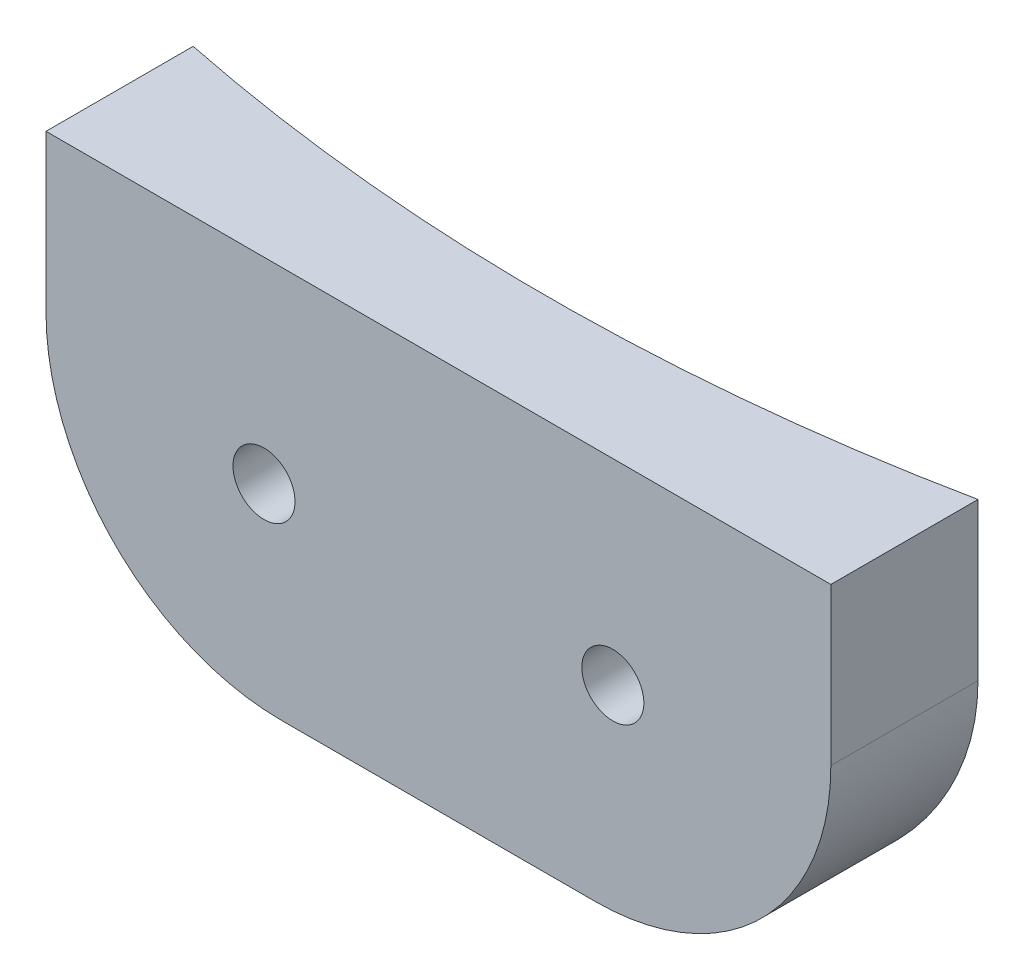
ISO-10303-21;
HEADER;
FILE_DESCRIPTION(('STEP AP214'),'2;1');
FILE_NAME('part.step','',(''),(''),'','','');
FILE_SCHEMA(('AUTOMOTIVE_DESIGN { 1 0 10303 214 1 1 1 1 }'));
ENDSEC;
DATA;
#1=APPLICATION_CONTEXT('core data for automotive mechanical design processes');
#2=APPLICATION_PROTOCOL_DEFINITION('international standard','automotive_design',2000,#1);
#3=PRODUCT_CONTEXT('',#1,'mechanical');
#4=PRODUCT('Part','Part','',(#3));
#5=PRODUCT_RELATED_PRODUCT_CATEGORY('part','',(#4));
#6=PRODUCT_DEFINITION_FORMATION('','',#4);
#7=PRODUCT_DEFINITION_CONTEXT('part definition',#1,'design');
#8=PRODUCT_DEFINITION('design','',#6,#7);
#9=PRODUCT_DEFINITION_SHAPE('','',#8);
#10=(LENGTH_UNIT() NAMED_UNIT(*) SI_UNIT(.MILLI.,.METRE.));
#11=(NAMED_UNIT(*) PLANE_ANGLE_UNIT() SI_UNIT($,.RADIAN.));
#12=(NAMED_UNIT(*) SI_UNIT($,.STERADIAN.) SOLID_ANGLE_UNIT());
#13=UNCERTAINTY_MEASURE_WITH_UNIT(LENGTH_MEASURE(1.E-05),#10,'distance_accuracy_value','');
#14=(GEOMETRIC_REPRESENTATION_CONTEXT(3) GLOBAL_UNCERTAINTY_ASSIGNED_CONTEXT((#13)) GLOBAL_UNIT_ASSIGNED_CONTEXT((#10,
#11,#12)) REPRESENTATION_CONTEXT('',''));
#15=CARTESIAN_POINT('',(0.,0.,0.));
#16=DIRECTION('',(0.,0.,1.));
#17=DIRECTION('',(1.,0.,0.));
#18=AXIS2_PLACEMENT_3D('',#15,#16,#17);
#19=CARTESIAN_POINT('',(0.,12.7,0.));
#20=DIRECTION('',(0.,-1.,0.));
#21=DIRECTION('',(0.,0.,-1.));
#22=AXIS2_PLACEMENT_3D('',#19,#20,#21);
#23=CYLINDRICAL_SURFACE('',#22,63.5);
#24=CARTESIAN_POINT('',(4.64114444444444,6.35,63.3301648367174));
#25=CARTESIAN_POINT('',(4.64114695278914,6.40623714740319,63.3301647205125));
#26=CARTESIAN_POINT('',(4.64588883149999,6.46251503125265,63.3298176984855));
#27=CARTESIAN_POINT('',(4.66473701975215,6.57351908417886,63.3284321168356));
#28=CARTESIAN_POINT('',(4.67885457723963,6.62824330700915,63.327392726578));
#29=CARTESIAN_POINT('',(4.7160448376379,6.73451414085425,63.3246339646137));
#30=CARTESIAN_POINT('',(4.73911284972963,6.78606239997985,63.322914949081));
#31=CARTESIAN_POINT('',(4.79353425647397,6.88453450948576,63.3188184532647));
#32=CARTESIAN_POINT('',(4.82488562025339,6.93145948951354,63.3164411343741));
#33=CARTESIAN_POINT('',(4.89501669169033,7.01943006795148,63.311057850007));
#34=CARTESIAN_POINT('',(4.93380472727038,7.06046898395219,63.3080511794043));
#35=CARTESIAN_POINT('',(5.01767798433643,7.13545490348017,63.3014586997648));
#36=CARTESIAN_POINT('',(5.0627635207434,7.16940155213033,63.297872861764));
#37=CARTESIAN_POINT('',(5.15806985848827,7.22933356815663,63.2901777790091));
#38=CARTESIAN_POINT('',(5.20830355887698,7.25529825214407,63.2860672128655));
#39=CARTESIAN_POINT('',(5.31238096803179,7.29842924083869,63.277415660694));
#40=CARTESIAN_POINT('',(5.36622473413357,7.31559540576886,63.2728746678296));
#41=CARTESIAN_POINT('',(5.4761786498746,7.34070065743048,63.2634532735112));
#42=CARTESIAN_POINT('',(5.53229558386467,7.34860963657356,63.2585718189924));
#43=CARTESIAN_POINT('',(5.6450431349119,7.35488733611016,63.2486101872706));
#44=CARTESIAN_POINT('',(5.70167376020645,7.35325590324544,63.2435300068765));
#45=CARTESIAN_POINT('',(5.81400219776037,7.34048711123001,63.233302682978));
#46=CARTESIAN_POINT('',(5.8696971074063,7.32932431917814,63.2281553966311));
#47=CARTESIAN_POINT('',(5.97842059113657,7.29777368000457,63.2179679405509));
#48=CARTESIAN_POINT('',(6.03144914015671,7.2773857461832,63.2129277718247));
#49=CARTESIAN_POINT('',(6.13336170092242,7.22794089864989,63.2031209609398));
#50=CARTESIAN_POINT('',(6.18224346888084,7.1988793296501,63.1983544673094));
#51=CARTESIAN_POINT('',(6.27443249344282,7.13290402334776,63.1892684392521));
#52=CARTESIAN_POINT('',(6.31773980652327,7.09599036560769,63.184948900297));
#53=CARTESIAN_POINT('',(6.39742944665497,7.01545141606892,63.1769301251959));
#54=CARTESIAN_POINT('',(6.43382903670366,6.97184336154829,63.1732293455488));
#55=CARTESIAN_POINT('',(6.49878178246781,6.87907878000634,63.166580601289));
#56=CARTESIAN_POINT('',(6.52733514375433,6.8299223983987,63.1636326169532));
#57=CARTESIAN_POINT('',(6.57564139496877,6.72770784336846,63.158621977438));
#58=CARTESIAN_POINT('',(6.59543577736685,6.67466948396411,63.1565551498398));
#59=CARTESIAN_POINT('',(6.6258414474378,6.56599573521499,63.1533725223341));
#60=CARTESIAN_POINT('',(6.6364529968323,6.51036041993417,63.1522566953218));
#61=CARTESIAN_POINT('',(6.64815339580896,6.3983385683328,63.1510260529398));
#62=CARTESIAN_POINT('',(6.64928458670598,6.34195649987584,63.1509067867228));
#63=CARTESIAN_POINT('',(6.64210232141257,6.22980449286256,63.1516626014891));
#64=CARTESIAN_POINT('',(6.6337889861862,6.17403454647552,63.1525376697369));
#65=CARTESIAN_POINT('',(6.60798025739342,6.06476930631786,63.1552433546533));
#66=CARTESIAN_POINT('',(6.59049775951404,6.01127093170214,63.157072629288));
#67=CARTESIAN_POINT('',(6.54686738020195,5.90797359433023,63.1616102216266));
#68=CARTESIAN_POINT('',(6.52071941322536,5.85817466810024,63.1643185480083));
#69=CARTESIAN_POINT('',(6.4604348778131,5.76354828536575,63.1705128852129));
#70=CARTESIAN_POINT('',(6.42627813296482,5.71873381363342,63.1740008591383));
#71=CARTESIAN_POINT('',(6.35099067628744,5.63546948081602,63.1816139815897));
#72=CARTESIAN_POINT('',(6.30985978385501,5.59701978460491,63.1857391466162));
#73=CARTESIAN_POINT('',(6.22157376355687,5.52737671026456,63.1944933791092));
#74=CARTESIAN_POINT('',(6.17439026333612,5.49621959564505,63.1991248035545));
#75=CARTESIAN_POINT('',(6.07549321902851,5.44226601289503,63.2087086351582));
#76=CARTESIAN_POINT('',(6.02377956431028,5.41946974901625,63.2136610501546));
#77=CARTESIAN_POINT('',(5.91704605332402,5.38278893040547,63.2237411835219));
#78=CARTESIAN_POINT('',(5.86201287432134,5.36894331576108,63.2288695670132));
#79=CARTESIAN_POINT('',(5.75040025442613,5.35070933434631,63.2391179291409));
#80=CARTESIAN_POINT('',(5.69382079149116,5.34632110246323,63.2442379076564));
#81=CARTESIAN_POINT('',(5.58062245784471,5.34713089366685,63.2543270226457));
#82=CARTESIAN_POINT('',(5.52400367521204,5.35234468486953,63.2592958973592));
#83=CARTESIAN_POINT('',(5.41243143947483,5.37225158499043,63.2689396351984));
#84=CARTESIAN_POINT('',(5.35747798288412,5.38694467406333,63.2736144989395));
#85=CARTESIAN_POINT('',(5.2508759486794,5.42538063545904,63.2825502140484));
#86=CARTESIAN_POINT('',(5.19922325231413,5.44911196160464,63.2868115849663));
#87=CARTESIAN_POINT('',(5.1006311069955,5.50496299437788,63.2948340046628));
#88=CARTESIAN_POINT('',(5.05369140486846,5.53708225008672,63.29859508032));
#89=CARTESIAN_POINT('',(4.96601453240116,5.60869182525746,63.3055339713231));
#90=CARTESIAN_POINT('',(4.92525855618289,5.64815894846271,63.3087135613904));
#91=CARTESIAN_POINT('',(4.85094158169337,5.73342673789043,63.3144514237991));
#92=CARTESIAN_POINT('',(4.81738225451812,5.7792288710795,63.3170095518524));
#93=CARTESIAN_POINT('',(4.75852419133233,5.87571863046791,63.3214601788366));
#94=CARTESIAN_POINT('',(4.73320359584166,5.92639285862004,63.3233544402249));
#95=CARTESIAN_POINT('',(4.69145564065224,6.03125185143414,63.3264611865357));
#96=CARTESIAN_POINT('',(4.67501747590747,6.0854322607045,63.3276744998683));
#97=CARTESIAN_POINT('',(4.65590265290836,6.17496796638905,63.3290819494507));
#98=CARTESIAN_POINT('',(4.65037534556688,6.20973722664739,63.3294877846053));
#99=CARTESIAN_POINT('',(4.6429954592254,6.27966567925237,63.3300292644079));
#100=CARTESIAN_POINT('',(4.64114287552866,6.31482487110058,63.3301649094011));
#101=CARTESIAN_POINT('',(4.64114444444444,6.35,63.3301648367174));
#102=B_SPLINE_CURVE_WITH_KNOTS('',3,(#24,#25,#26,#27,#28,#29,#30,#31,#32,#33,#34,#35,#36,#37,
#38,#39,#40,#41,#42,#43,#44,#45,#46,#47,#48,#49,#50,#51,#52,#53,#54,#55,#56,#57,#58,#59,#60,#61,
#62,#63,#64,#65,#66,#67,#68,#69,#70,#71,#72,#73,#74,#75,#76,#77,#78,#79,#80,#81,#82,#83,#84,#85,
#86,#87,#88,#89,#90,#91,#92,#93,#94,#95,#96,#97,#98,#99,#100,#101),.UNSPECIFIED.,.T.,.F.,(4,2,2,
2,2,2,2,2,2,2,2,2,2,2,2,2,2,2,2,2,2,2,2,2,2,2,2,2,2,2,2,2,2,2,2,2,2,2,4),(0.,0.168582910968482,
0.337368436090966,0.506065622097464,0.674721486040734,0.843567333435946,1.01242162738004,
1.18170984949717,1.3510007609157,1.52084074868163,1.69068346478348,1.8609808002614,
2.03127973626012,2.20167023947487,2.37205901626426,2.5420162015499,2.71196893353567,
2.88110772460663,3.0502416948626,3.2186198717315,3.38699589206239,3.5551357376282,
3.72327724308832,3.8918469850999,4.06042109308027,4.22981645150797,4.39921594791104,
4.56934754902163,4.73948157664298,4.90989524174182,5.08030855007356,5.25050488489732,
5.42069207217933,5.59035084080781,5.76004896245023,5.92929308834748,6.09833087083474,
6.20377599877129,6.30922099193644),.UNSPECIFIED.);
#103=CARTESIAN_POINT('',(4.64114444444444,6.35,63.3301648367174));
#104=VERTEX_POINT('',#103);
#105=EDGE_CURVE('E171',#104,#104,#102,.T.);
#106=ORIENTED_EDGE('',*,*,#105,.F.);
#107=EDGE_LOOP('',(#106));
#108=FACE_BOUND('',#107,.T.);
#109=DIRECTION('',(0.,-1.,0.));
#110=VECTOR('',#109,1.);
#111=CARTESIAN_POINT('',(12.7,12.7,62.2170394666927));
#112=LINE('',#111,#110);
#113=CARTESIAN_POINT('',(12.7,12.7,62.2170394666927));
#114=VERTEX_POINT('',#113);
#115=CARTESIAN_POINT('',(12.7,7.62,62.2170394666927));
#116=VERTEX_POINT('',#115);
#117=EDGE_CURVE('E130',#114,#116,#112,.T.);
#118=ORIENTED_EDGE('',*,*,#117,.T.);
#119=CARTESIAN_POINT('',(12.7,7.62,62.2170394666927));
#120=CARTESIAN_POINT('',(12.700025344572,7.40828698854175,62.2170260491477));
#121=CARTESIAN_POINT('',(12.6911777948314,7.19657987497164,62.2188400407955));
#122=CARTESIAN_POINT('',(12.6559216828134,6.77471626691733,62.2260254545056));
#123=CARTESIAN_POINT('',(12.6295150529205,6.56455960437821,62.231396485114));
#124=CARTESIAN_POINT('',(12.5593777999632,6.14759949257848,62.2455880424606));
#125=CARTESIAN_POINT('',(12.5156730617354,5.94079151148967,62.2544034148448));
#126=CARTESIAN_POINT('',(12.4112928823802,5.53167390932802,62.2752973349806));
#127=CARTESIAN_POINT('',(12.3506174306677,5.32936429106103,62.2873758847677));
#128=CARTESIAN_POINT('',(12.2127661061429,4.93066154319659,62.3145510233819));
#129=CARTESIAN_POINT('',(12.1355904901467,4.73426832156793,62.3296475652356));
#130=CARTESIAN_POINT('',(11.9652932532413,4.34867390222739,62.3625631088523));
#131=CARTESIAN_POINT('',(11.8721657605176,4.15947538430401,62.3803831128484));
#132=CARTESIAN_POINT('',(11.6706887891849,3.78965333015597,62.4183909182039));
#133=CARTESIAN_POINT('',(11.5623415931071,3.60902851353972,62.4385783644382));
#134=CARTESIAN_POINT('',(11.3311918454023,3.25751782799266,62.4809402333614));
#135=CARTESIAN_POINT('',(11.2083887507748,3.08663232525341,62.5031147306815));
#136=CARTESIAN_POINT('',(10.9477113683039,2.75383642683002,62.5493031972765));
#137=CARTESIAN_POINT('',(10.8096810040173,2.59205079104604,62.573335279116));
#138=CARTESIAN_POINT('',(10.5206867724196,2.28066973268071,62.6225728430067));
#139=CARTESIAN_POINT('',(10.3697228175217,2.13107439266601,62.6477783330038));
#140=CARTESIAN_POINT('',(10.0558633178888,1.8450301311244,62.6989225853166));
#141=CARTESIAN_POINT('',(9.89296490237415,1.70858439107044,62.7248615231325));
#142=CARTESIAN_POINT('',(9.55637879028887,1.4497893210675,62.777023044104));
#143=CARTESIAN_POINT('',(9.38269122958812,1.32743981365727,62.8032456236842));
#144=CARTESIAN_POINT('',(9.0229993506751,1.09592267835218,62.8559385268488));
#145=CARTESIAN_POINT('',(8.8368488232233,0.986981585237584,62.8824066255162));
#146=CARTESIAN_POINT('',(8.45599206584206,0.785272469216312,62.9347529910899));
#147=CARTESIAN_POINT('',(8.2612889008333,0.692498710842588,62.9606314643261));
#148=CARTESIAN_POINT('',(7.86466329934288,0.523770888224452,63.0114037881705));
#149=CARTESIAN_POINT('',(7.66274311304734,0.447811633632491,63.0362979406672));
#150=CARTESIAN_POINT('',(7.2531264658293,0.313262144610086,63.0847424716456));
#151=CARTESIAN_POINT('',(7.04543133959186,0.254667932731201,63.1082931568479));
#152=CARTESIAN_POINT('',(6.54837922821547,0.137006691979756,63.1621080063384));
#153=CARTESIAN_POINT('',(6.25705443505743,0.0856748570420428,63.1916598413567));
#154=CARTESIAN_POINT('',(5.81715464870499,0.0343009255753581,63.2331597179957));
#155=CARTESIAN_POINT('',(5.67008456709404,0.0214469378299054,63.2465177875438));
#156=CARTESIAN_POINT('',(5.37537069796819,0.00429760958948188,63.2722472948987));
#157=CARTESIAN_POINT('',(5.22772695110383,1.67335718152917E-06,63.2846188013239));
#158=CARTESIAN_POINT('',(5.08000000000001,0.,63.2964738354357));
#159=B_SPLINE_CURVE_WITH_KNOTS('',3,(#119,#120,#121,#122,#123,#124,#125,#126,#127,#128,#129,
#130,#131,#132,#133,#134,#135,#136,#137,#138,#139,#140,#141,#142,#143,#144,#145,#146,#147,#148,
#149,#150,#151,#152,#153,#154,#155,#156,#157,#158),.UNSPECIFIED.,.F.,.F.,(4,2,2,2,2,2,2,2,2,2,2,
2,2,2,2,2,2,2,2,4),(0.,0.634937674846585,1.26980548608461,1.90372685319809,2.53764861570588,
3.17156051228586,3.80570625242187,4.43975698971342,5.07383155117456,5.71514615624657,
6.35646510467457,6.99793882916962,7.63940447709726,8.29054072661027,8.94144550897539,
9.59214908719896,10.2427035069186,11.1322670135707,11.57675789098,12.0212178257077),.UNSPECIFIED.);
#160=CARTESIAN_POINT('',(5.08000000000001,0.,63.2964738354357));
#161=VERTEX_POINT('',#160);
#162=EDGE_CURVE('E56',#116,#161,#159,.T.);
#163=ORIENTED_EDGE('',*,*,#162,.T.);
#164=CARTESIAN_POINT('',(0.,0.,0.));
#165=DIRECTION('',(0.,1.,0.));
#166=DIRECTION('',(0.,0.,1.));
#167=AXIS2_PLACEMENT_3D('',#164,#165,#166);
#168=CIRCLE('',#167,63.5);
#169=CARTESIAN_POINT('',(-5.07999999999999,0.,63.2964738354357));
#170=VERTEX_POINT('',#169);
#171=EDGE_CURVE('E122',#170,#161,#168,.T.);
#172=ORIENTED_EDGE('',*,*,#171,.F.);
#173=CARTESIAN_POINT('',(-5.07999999999999,0.,63.2964738354357));
#174=CARTESIAN_POINT('',(-5.29532177734775,-2.33084172623505E-05,63.2792038185139));
#175=CARTESIAN_POINT('',(-5.51054539309441,0.00912557571904402,63.2608140470481));
#176=CARTESIAN_POINT('',(-5.93924585119758,0.0455512941111531,63.2220001236722));
#177=CARTESIAN_POINT('',(-6.15272288022638,0.072826164778146,63.2015761923263));
#178=CARTESIAN_POINT('',(-6.57619312281003,0.145247508457728,63.1589188099163));
#179=CARTESIAN_POINT('',(-6.7861899224905,0.190374216891556,63.1366873815674));
#180=CARTESIAN_POINT('',(-7.20146899504584,0.298130021288826,63.0906685996438));
#181=CARTESIAN_POINT('',(-7.40675124757998,0.36075919275055,63.0668812393577));
#182=CARTESIAN_POINT('',(-7.81117433896537,0.503045595686192,63.0180692537221));
#183=CARTESIAN_POINT('',(-8.01031517187719,0.582702843627513,62.9930446271761));
#184=CARTESIAN_POINT('',(-8.40115696184806,0.758495187591141,62.9421116335453));
#185=CARTESIAN_POINT('',(-8.59285515139037,0.854636342461205,62.9162029443279));
#186=CARTESIAN_POINT('',(-8.96738357383356,1.06267373352409,62.8639147846366));
#187=CARTESIAN_POINT('',(-9.15021558910631,1.17456678530376,62.8375354102555));
#188=CARTESIAN_POINT('',(-9.50580714769593,1.41335047485512,62.7847270102528));
#189=CARTESIAN_POINT('',(-9.67856644201161,1.54024148314701,62.7582979834204));
#190=CARTESIAN_POINT('',(-10.0139335069992,1.80904589144173,62.7056627666621));
#191=CARTESIAN_POINT('',(-10.176466176295,1.95105352952414,62.6794592252326));
#192=CARTESIAN_POINT('',(-10.488975825278,2.24841711941726,62.627920872193));
#193=CARTESIAN_POINT('',(-10.6389527471308,2.40377313270675,62.6025860645849));
#194=CARTESIAN_POINT('',(-10.9253059363616,2.7268013701968,62.5532477886997));
#195=CARTESIAN_POINT('',(-11.0616796895713,2.89447586121847,62.5292445668918));
#196=CARTESIAN_POINT('',(-11.3197958883905,3.24095744412969,62.4830330339896));
#197=CARTESIAN_POINT('',(-11.4415388348639,3.41976415460587,62.4608246614597));
#198=CARTESIAN_POINT('',(-11.669142535504,3.78671529190283,62.4187029108345));
#199=CARTESIAN_POINT('',(-11.7750503655977,3.97482973525303,62.3987827727284));
#200=CARTESIAN_POINT('',(-11.9705781354314,4.35949881028934,62.3615680086552));
#201=CARTESIAN_POINT('',(-12.0602043318897,4.55605016378339,62.3442723745644));
#202=CARTESIAN_POINT('',(-12.2224800718579,4.95617668672,62.3126618013586));
#203=CARTESIAN_POINT('',(-12.2951373745025,5.15974859690492,62.298345500252));
#204=CARTESIAN_POINT('',(-12.4229244236983,5.572431900492,62.2729891676862));
#205=CARTESIAN_POINT('',(-12.4780589725322,5.78154175911617,62.2619482386343));
#206=CARTESIAN_POINT('',(-12.5825800907558,6.25974262188812,62.2409214383508));
#207=CARTESIAN_POINT('',(-12.6266004242542,6.53008568212433,62.2319848180626));
#208=CARTESIAN_POINT('',(-12.6706295488993,6.93776509967448,62.2230289639976));
#209=CARTESIAN_POINT('',(-12.6816390168082,7.07396258307784,62.2207852014459));
#210=CARTESIAN_POINT('',(-12.6963236841772,7.34676259574632,62.217790044152));
#211=CARTESIAN_POINT('',(-12.6999992129868,7.48336510654673,62.2170385823942));
#212=CARTESIAN_POINT('',(-12.7,7.62,62.2170394666927));
#213=B_SPLINE_CURVE_WITH_KNOTS('',3,(#173,#174,#175,#176,#177,#178,#179,#180,#181,#182,#183,
#184,#185,#186,#187,#188,#189,#190,#191,#192,#193,#194,#195,#196,#197,#198,#199,#200,#201,#202,
#203,#204,#205,#206,#207,#208,#209,#210,#211,#212),.UNSPECIFIED.,.F.,.F.,(4,2,2,2,2,2,2,2,2,2,2,
2,2,2,2,2,2,2,2,4),(0.,0.64783118440762,1.29559220067578,1.94263804952571,2.58968668950305,
3.2367359552269,3.88402356314178,4.53118050241107,5.17835343284951,5.8298276664353,
6.48130490068559,7.13290232018638,7.7844774268557,8.43407522358336,9.08342286188103,
9.73247299795643,10.3813451017738,11.2016331756621,11.6114402566625,12.02122893381),.UNSPECIFIED.);
#214=CARTESIAN_POINT('',(-12.7,7.62,62.2170394666927));
#215=VERTEX_POINT('',#214);
#216=EDGE_CURVE('E63',#170,#215,#213,.T.);
#217=ORIENTED_EDGE('',*,*,#216,.T.);
#218=DIRECTION('',(0.,-1.,0.));
#219=VECTOR('',#218,1.);
#220=CARTESIAN_POINT('',(-12.7,12.7,62.2170394666927));
#221=LINE('',#220,#219);
#222=CARTESIAN_POINT('',(-12.7,12.7,62.2170394666927));
#223=VERTEX_POINT('',#222);
#224=EDGE_CURVE('E189',#223,#215,#221,.T.);
#225=ORIENTED_EDGE('',*,*,#224,.F.);
#226=CARTESIAN_POINT('',(0.,12.7,0.));
#227=DIRECTION('',(0.,1.,0.));
#228=DIRECTION('',(0.,0.,1.));
#229=AXIS2_PLACEMENT_3D('',#226,#227,#228);
#230=CIRCLE('',#229,63.5);
#231=EDGE_CURVE('E120',#223,#114,#230,.T.);
#232=ORIENTED_EDGE('',*,*,#231,.T.);
#233=EDGE_LOOP('',(#118,#163,#172,#217,#225,#232));
#234=FACE_BOUND('',#233,.T.);
#235=CARTESIAN_POINT('',(-6.64774444444444,6.35,63.1510688254867));
#236=CARTESIAN_POINT('',(-6.64774191766992,6.29386444009447,63.1510691591726));
#237=CARTESIAN_POINT('',(-6.64301694170919,6.23768813034969,63.1515670315065));
#238=CARTESIAN_POINT('',(-6.62423843639841,6.12688735169231,63.1535394953302));
#239=CARTESIAN_POINT('',(-6.61017368767154,6.07226483166103,63.1550152615078));
#240=CARTESIAN_POINT('',(-6.57313105963243,5.96619747612689,63.1588813450893));
#241=CARTESIAN_POINT('',(-6.550158579114,5.91475073769936,63.1612711085261));
#242=CARTESIAN_POINT('',(-6.49597281019972,5.81646530569776,63.1668669121653));
#243=CARTESIAN_POINT('',(-6.46476145605948,5.76962553407576,63.1700727607675));
#244=CARTESIAN_POINT('',(-6.3948948036577,5.68172181224584,63.1771838017353));
#245=CARTESIAN_POINT('',(-6.35621926758756,5.64067410225999,63.181090893333));
#246=CARTESIAN_POINT('',(-6.2725808794811,5.56564541643028,63.1894492133228));
#247=CARTESIAN_POINT('',(-6.22761762564998,5.53166489253587,63.193900476486));
#248=CARTESIAN_POINT('',(-6.13243609975948,5.47155889049825,63.2032081610385));
#249=CARTESIAN_POINT('',(-6.08219270013718,5.44547349711448,63.2080664951775));
#250=CARTESIAN_POINT('',(-5.97805867799765,5.40211092581005,63.2180001868824));
#251=CARTESIAN_POINT('',(-5.92416797884318,5.38483393303709,63.2230755490076));
#252=CARTESIAN_POINT('',(-5.81405543064463,5.35952241593329,63.2332968140151));
#253=CARTESIAN_POINT('',(-5.75782581058771,5.35152176144569,63.2384429064133));
#254=CARTESIAN_POINT('',(-5.64481266769086,5.34510493561892,63.2486308827044));
#255=CARTESIAN_POINT('',(-5.58802914195281,5.34668881445461,63.2536727660516));
#256=CARTESIAN_POINT('',(-5.47548115439048,5.35940846691345,63.2635147616719));
#257=CARTESIAN_POINT('',(-5.41971740169883,5.37055064717849,63.2683147094976));
#258=CARTESIAN_POINT('',(-5.31083964954695,5.40209128565405,63.2775471168391));
#259=CARTESIAN_POINT('',(-5.25772563127309,5.42248967813332,63.2819795789641));
#260=CARTESIAN_POINT('',(-5.15577334666332,5.4719256308149,63.290367476127));
#261=CARTESIAN_POINT('',(-5.10692676368125,5.50094587916316,63.2943238449571));
#262=CARTESIAN_POINT('',(-5.01479592456022,5.56682661828968,63.3016900331422));
#263=CARTESIAN_POINT('',(-4.97151157604156,5.60368697882939,63.3050998615746));
#264=CARTESIAN_POINT('',(-4.89188485943442,5.68407548530355,63.3113027517811));
#265=CARTESIAN_POINT('',(-4.85552072001409,5.72758191664035,63.3140977523121));
#266=CARTESIAN_POINT('',(-4.79061362488078,5.82011557611958,63.3190420342522));
#267=CARTESIAN_POINT('',(-4.76207054273879,5.86914271500057,63.3211913260994));
#268=CARTESIAN_POINT('',(-4.71370478243518,5.97116967168562,63.3248101187711));
#269=CARTESIAN_POINT('',(-4.69385659133669,6.02415732541583,63.3262816090942));
#270=CARTESIAN_POINT('',(-4.66333167175817,6.13272551198539,63.3285368062098));
#271=CARTESIAN_POINT('',(-4.6526548358731,6.18830601445205,63.3293205210568));
#272=CARTESIAN_POINT('',(-4.64079275176509,6.30037057422027,63.3301908941272));
#273=CARTESIAN_POINT('',(-4.63958977206824,6.35685274521676,63.3302788545411));
#274=CARTESIAN_POINT('',(-4.64666335279107,6.46921690469989,63.3297602379289));
#275=CARTESIAN_POINT('',(-4.65493986375642,6.52509889631611,63.3291536645262));
#276=CARTESIAN_POINT('',(-4.68072699606323,6.63464806225636,63.3272529017596));
#277=CARTESIAN_POINT('',(-4.69823301206411,6.68831632679866,63.3259590553289));
#278=CARTESIAN_POINT('',(-4.74197219493518,6.7919478619959,63.3226987569588));
#279=CARTESIAN_POINT('',(-4.76820537647031,6.84191112642487,63.320732303889));
#280=CARTESIAN_POINT('',(-4.82867328083853,6.93676627617572,63.3161498435771));
#281=CARTESIAN_POINT('',(-4.86291532057057,6.98165346802659,63.3135332422218));
#282=CARTESIAN_POINT('',(-4.93840617288562,7.06504130215987,63.3076896905256));
#283=CARTESIAN_POINT('',(-4.979655054105,7.10354188187414,63.304462734206));
#284=CARTESIAN_POINT('',(-5.06808177647478,7.17315883285405,63.297444773447));
#285=CARTESIAN_POINT('',(-5.11527267291006,7.20425849480005,63.2936525235124));
#286=CARTESIAN_POINT('',(-5.21416588585686,7.25809749194997,63.2855823416962));
#287=CARTESIAN_POINT('',(-5.26586827066189,7.28083670056876,63.281304402462));
#288=CARTESIAN_POINT('',(-5.37248741607339,7.31738619037588,63.2723418835893));
#289=CARTESIAN_POINT('',(-5.42741374937632,7.33116824405429,63.2676560706821));
#290=CARTESIAN_POINT('',(-5.53877689122864,7.34931386910945,63.2580040257346));
#291=CARTESIAN_POINT('',(-5.59521373093089,7.35367724608258,63.2530377879085));
#292=CARTESIAN_POINT('',(-5.70817685549732,7.35287035847364,63.2429438134017));
#293=CARTESIAN_POINT('',(-5.76470289619782,7.34767127917687,63.237815634518));
#294=CARTESIAN_POINT('',(-5.87607451845174,7.32783321979057,63.227564217767));
#295=CARTESIAN_POINT('',(-5.93092007605322,7.31319410521769,63.2224409799712));
#296=CARTESIAN_POINT('',(-6.03745230787351,7.27485932251626,63.2123566925509));
#297=CARTESIAN_POINT('',(-6.08913450618251,7.25115115098782,63.2073958771529));
#298=CARTESIAN_POINT('',(-6.18778306610762,7.19534330385348,63.1978148339749));
#299=CARTESIAN_POINT('',(-6.23474962799008,7.16324398481647,63.1931945917334));
#300=CARTESIAN_POINT('',(-6.3225487134949,7.09161325266094,63.1844705962089));
#301=CARTESIAN_POINT('',(-6.36339131822066,7.05209430060916,63.1803659959367));
#302=CARTESIAN_POINT('',(-6.43786536217007,6.96668817693304,63.1728208550684));
#303=CARTESIAN_POINT('',(-6.47149515934137,6.92079955911256,63.1693804657029));
#304=CARTESIAN_POINT('',(-6.53043468766444,6.82415702893236,63.1633145116601));
#305=CARTESIAN_POINT('',(-6.55577566238579,6.77342234035303,63.1606858892839));
#306=CARTESIAN_POINT('',(-6.59754661152467,6.66842112489033,63.1563363728641));
#307=CARTESIAN_POINT('',(-6.61398762179285,6.61415906590328,63.154614354715));
#308=CARTESIAN_POINT('',(-6.63305639316193,6.52461794789097,63.1526136648929));
#309=CARTESIAN_POINT('',(-6.63855731591587,6.4899311390862,63.1520353639824));
#310=CARTESIAN_POINT('',(-6.64590212550859,6.42016819421371,63.151262840593));
#311=CARTESIAN_POINT('',(-6.64774602400866,6.38509205938781,63.1510686168894));
#312=CARTESIAN_POINT('',(-6.64774444444444,6.35,63.1510688254867));
#313=B_SPLINE_CURVE_WITH_KNOTS('',3,(#235,#236,#237,#238,#239,#240,#241,#242,#243,#244,#245,
#246,#247,#248,#249,#250,#251,#252,#253,#254,#255,#256,#257,#258,#259,#260,#261,#262,#263,#264,
#265,#266,#267,#268,#269,#270,#271,#272,#273,#274,#275,#276,#277,#278,#279,#280,#281,#282,#283,
#284,#285,#286,#287,#288,#289,#290,#291,#292,#293,#294,#295,#296,#297,#298,#299,#300,#301,#302,
#303,#304,#305,#306,#307,#308,#309,#310,#311,#312),.UNSPECIFIED.,.T.,.F.,(4,2,2,2,2,2,2,2,2,2,2,
2,2,2,2,2,2,2,2,2,2,2,2,2,2,2,2,2,2,2,2,2,2,2,2,2,2,2,4),(0.,0.168278202466684,
0.336758915225147,0.505137674479718,0.673476938245171,0.842279204386989,1.0110922621854,
1.18074856162278,1.35040842699466,1.52068582430184,1.69096411300914,1.8613566233865,
2.03174792377221,2.20179938088565,2.37184801335511,2.54135248442974,2.71085421526807,
2.87985519966513,3.04885420487729,3.21753683255188,3.38621858021628,3.55481623857286,
3.72341418023906,3.89216675896408,4.0609209908208,4.23005268529228,4.39918694047146,
4.56885165222392,4.73851986586073,4.90870018149642,5.07888292158541,5.24930114117526,
5.41971212028194,5.58983941837318,5.76000540626661,5.92952238030424,6.09882867098463,
6.20402486952411,6.30922073262005),.UNSPECIFIED.);
#314=CARTESIAN_POINT('',(-6.64774444444444,6.35,63.1510688254867));
#315=VERTEX_POINT('',#314);
#316=EDGE_CURVE('E134',#315,#315,#313,.T.);
#317=ORIENTED_EDGE('',*,*,#316,.T.);
#318=EDGE_LOOP('',(#317));
#319=FACE_BOUND('',#318,.T.);
#320=ADVANCED_FACE('F47',(#108,#234,#319),#23,.F.);
#321=CARTESIAN_POINT('',(-12.7,12.7,0.));
#322=DIRECTION('',(1.,0.,0.));
#323=DIRECTION('',(0.,0.,-1.));
#324=AXIS2_PLACEMENT_3D('',#321,#322,#323);
#325=PLANE('',#324);
#326=ORIENTED_EDGE('',*,*,#224,.T.);
#327=DIRECTION('',(0.,0.,1.));
#328=VECTOR('',#327,1.);
#329=CARTESIAN_POINT('',(-12.7,7.62,0.));
#330=LINE('',#329,#328);
#331=CARTESIAN_POINT('',(-12.7,7.62,66.9795394666927));
#332=VERTEX_POINT('',#331);
#333=EDGE_CURVE('E11',#215,#332,#330,.T.);
#334=ORIENTED_EDGE('',*,*,#333,.T.);
#335=DIRECTION('',(0.,-1.,0.));
#336=VECTOR('',#335,1.);
#337=CARTESIAN_POINT('',(-12.7,12.7,66.9795394666927));
#338=LINE('',#337,#336);
#339=CARTESIAN_POINT('',(-12.7,12.7,66.9795394666927));
#340=VERTEX_POINT('',#339);
#341=EDGE_CURVE('E108',#340,#332,#338,.T.);
#342=ORIENTED_EDGE('',*,*,#341,.F.);
#343=DIRECTION('',(0.,0.,1.));
#344=VECTOR('',#343,1.);
#345=CARTESIAN_POINT('',(-12.7,12.7,0.));
#346=LINE('',#345,#344);
#347=EDGE_CURVE('E114',#223,#340,#346,.T.);
#348=ORIENTED_EDGE('',*,*,#347,.F.);
#349=EDGE_LOOP('',(#326,#334,#342,#348));
#350=FACE_BOUND('',#349,.T.);
#351=ADVANCED_FACE('F124',(#350),#325,.F.);
#352=CARTESIAN_POINT('',(0.,12.7,66.9795394666927));
#353=DIRECTION('',(0.,0.,-1.));
#354=DIRECTION('',(-1.,0.,0.));
#355=AXIS2_PLACEMENT_3D('',#352,#353,#354);
#356=PLANE('',#355);
#357=CARTESIAN_POINT('',(5.64444444444444,6.35,66.9795394666927));
#358=DIRECTION('',(0.,0.,-1.));
#359=DIRECTION('',(-1.,0.,0.));
#360=AXIS2_PLACEMENT_3D('',#357,#358,#359);
#361=CIRCLE('',#360,1.0033);
#362=CARTESIAN_POINT('',(4.64114444444444,6.35,66.9795394666927));
#363=VERTEX_POINT('',#362);
#364=EDGE_CURVE('E180',#363,#363,#361,.F.);
#365=ORIENTED_EDGE('',*,*,#364,.F.);
#366=EDGE_LOOP('',(#365));
#367=FACE_BOUND('',#366,.T.);
#368=CARTESIAN_POINT('',(-5.64444444444444,6.35,66.9795394666927));
#369=DIRECTION('',(0.,0.,-1.));
#370=DIRECTION('',(-1.,0.,0.));
#371=AXIS2_PLACEMENT_3D('',#368,#369,#370);
#372=CIRCLE('',#371,1.0033);
#373=CARTESIAN_POINT('',(-6.64774444444444,6.35,66.9795394666927));
#374=VERTEX_POINT('',#373);
#375=EDGE_CURVE('E142',#374,#374,#372,.T.);
#376=ORIENTED_EDGE('',*,*,#375,.T.);
#377=EDGE_LOOP('',(#376));
#378=FACE_BOUND('',#377,.T.);
#379=DIRECTION('',(1.,0.,0.));
#380=VECTOR('',#379,1.);
#381=CARTESIAN_POINT('',(0.,0.,66.9795394666927));
#382=LINE('',#381,#380);
#383=CARTESIAN_POINT('',(-5.07999999999999,0.,66.9795394666927));
#384=VERTEX_POINT('',#383);
#385=CARTESIAN_POINT('',(5.08000000000001,0.,66.9795394666927));
#386=VERTEX_POINT('',#385);
#387=EDGE_CURVE('E141',#384,#386,#382,.T.);
#388=ORIENTED_EDGE('',*,*,#387,.T.);
#389=CARTESIAN_POINT('',(5.08000000000001,7.62,66.9795394666927));
#390=DIRECTION('',(0.,0.,-1.));
#391=DIRECTION('',(-1.,0.,0.));
#392=AXIS2_PLACEMENT_3D('',#389,#390,#391);
#393=CIRCLE('',#392,7.62);
#394=CARTESIAN_POINT('',(12.7,7.62,66.9795394666927));
#395=VERTEX_POINT('',#394);
#396=EDGE_CURVE('E196',#386,#395,#393,.F.);
#397=ORIENTED_EDGE('',*,*,#396,.T.);
#398=DIRECTION('',(0.,-1.,0.));
#399=VECTOR('',#398,1.);
#400=CARTESIAN_POINT('',(12.7,12.7,66.9795394666927));
#401=LINE('',#400,#399);
#402=CARTESIAN_POINT('',(12.7,12.7,66.9795394666927));
#403=VERTEX_POINT('',#402);
#404=EDGE_CURVE('E109',#403,#395,#401,.T.);
#405=ORIENTED_EDGE('',*,*,#404,.F.);
#406=DIRECTION('',(1.,0.,0.));
#407=VECTOR('',#406,1.);
#408=CARTESIAN_POINT('',(0.,12.7,66.9795394666927));
#409=LINE('',#408,#407);
#410=EDGE_CURVE('E103',#340,#403,#409,.T.);
#411=ORIENTED_EDGE('',*,*,#410,.F.);
#412=ORIENTED_EDGE('',*,*,#341,.T.);
#413=CARTESIAN_POINT('',(-5.07999999999999,7.62,66.9795394666927));
#414=DIRECTION('',(0.,0.,-1.));
#415=DIRECTION('',(-1.,0.,0.));
#416=AXIS2_PLACEMENT_3D('',#413,#414,#415);
#417=CIRCLE('',#416,7.62);
#418=EDGE_CURVE('E194',#332,#384,#417,.F.);
#419=ORIENTED_EDGE('',*,*,#418,.T.);
#420=EDGE_LOOP('',(#388,#397,#405,#411,#412,#419));
#421=FACE_BOUND('',#420,.T.);
#422=ADVANCED_FACE('F106',(#367,#378,#421),#356,.F.);
#423=CARTESIAN_POINT('',(12.7,12.7,0.));
#424=DIRECTION('',(1.,0.,0.));
#425=DIRECTION('',(0.,0.,-1.));
#426=AXIS2_PLACEMENT_3D('',#423,#424,#425);
#427=PLANE('',#426);
#428=ORIENTED_EDGE('',*,*,#404,.T.);
#429=DIRECTION('',(0.,0.,1.));
#430=VECTOR('',#429,1.);
#431=CARTESIAN_POINT('',(12.7,7.62,62.2170394666927));
#432=LINE('',#431,#430);
#433=EDGE_CURVE('E71',#395,#116,#432,.F.);
#434=ORIENTED_EDGE('',*,*,#433,.T.);
#435=ORIENTED_EDGE('',*,*,#117,.F.);
#436=DIRECTION('',(0.,0.,1.));
#437=VECTOR('',#436,1.);
#438=CARTESIAN_POINT('',(12.7,12.7,0.));
#439=LINE('',#438,#437);
#440=EDGE_CURVE('E113',#114,#403,#439,.T.);
#441=ORIENTED_EDGE('',*,*,#440,.T.);
#442=EDGE_LOOP('',(#428,#434,#435,#441));
#443=FACE_BOUND('',#442,.T.);
#444=ADVANCED_FACE('F157',(#443),#427,.T.);
#445=CARTESIAN_POINT('',(0.,12.7,0.));
#446=DIRECTION('',(0.,1.,0.));
#447=DIRECTION('',(0.,0.,1.));
#448=AXIS2_PLACEMENT_3D('',#445,#446,#447);
#449=PLANE('',#448);
#450=ORIENTED_EDGE('',*,*,#347,.T.);
#451=ORIENTED_EDGE('',*,*,#410,.T.);
#452=ORIENTED_EDGE('',*,*,#440,.F.);
#453=ORIENTED_EDGE('',*,*,#231,.F.);
#454=EDGE_LOOP('',(#450,#451,#452,#453));
#455=FACE_BOUND('',#454,.T.);
#456=ADVANCED_FACE('F118',(#455),#449,.T.);
#457=CARTESIAN_POINT('',(0.,0.,0.));
#458=DIRECTION('',(0.,1.,0.));
#459=DIRECTION('',(0.,0.,1.));
#460=AXIS2_PLACEMENT_3D('',#457,#458,#459);
#461=PLANE('',#460);
#462=ORIENTED_EDGE('',*,*,#171,.T.);
#463=DIRECTION('',(0.,0.,1.));
#464=VECTOR('',#463,1.);
#465=CARTESIAN_POINT('',(5.08000000000001,0.,66.9795394666927));
#466=LINE('',#465,#464);
#467=EDGE_CURVE('E128',#161,#386,#466,.T.);
#468=ORIENTED_EDGE('',*,*,#467,.T.);
#469=ORIENTED_EDGE('',*,*,#387,.F.);
#470=DIRECTION('',(0.,0.,1.));
#471=VECTOR('',#470,1.);
#472=CARTESIAN_POINT('',(-5.07999999999999,0.,0.));
#473=LINE('',#472,#471);
#474=EDGE_CURVE('E126',#384,#170,#473,.F.);
#475=ORIENTED_EDGE('',*,*,#474,.T.);
#476=EDGE_LOOP('',(#462,#468,#469,#475));
#477=FACE_BOUND('',#476,.T.);
#478=ADVANCED_FACE('F153',(#477),#461,.F.);
#479=CARTESIAN_POINT('',(-5.64444444444444,6.35,69.8173004009506));
#480=DIRECTION('',(0.,0.,-1.));
#481=DIRECTION('',(-1.,0.,0.));
#482=AXIS2_PLACEMENT_3D('',#479,#480,#481);
#483=CYLINDRICAL_SURFACE('',#482,1.0033);
#484=ORIENTED_EDGE('',*,*,#316,.F.);
#485=EDGE_LOOP('',(#484));
#486=FACE_BOUND('',#485,.T.);
#487=ORIENTED_EDGE('',*,*,#375,.F.);
#488=EDGE_LOOP('',(#487));
#489=FACE_BOUND('',#488,.T.);
#490=ADVANCED_FACE('F147',(#486,#489),#483,.F.);
#491=CARTESIAN_POINT('',(5.64444444444444,6.35,69.8173004009506));
#492=DIRECTION('',(0.,0.,-1.));
#493=DIRECTION('',(-1.,0.,0.));
#494=AXIS2_PLACEMENT_3D('',#491,#492,#493);
#495=CYLINDRICAL_SURFACE('',#494,1.0033);
#496=ORIENTED_EDGE('',*,*,#105,.T.);
#497=EDGE_LOOP('',(#496));
#498=FACE_BOUND('',#497,.T.);
#499=ORIENTED_EDGE('',*,*,#364,.T.);
#500=EDGE_LOOP('',(#499));
#501=FACE_BOUND('',#500,.T.);
#502=ADVANCED_FACE('F152',(#498,#501),#495,.F.);
#503=CARTESIAN_POINT('',(5.07999999999998,7.62,0.));
#504=DIRECTION('',(0.,0.,-1.));
#505=DIRECTION('',(-1.,0.,0.));
#506=AXIS2_PLACEMENT_3D('',#503,#504,#505);
#507=CYLINDRICAL_SURFACE('',#506,7.62);
#508=ORIENTED_EDGE('',*,*,#162,.F.);
#509=ORIENTED_EDGE('',*,*,#433,.F.);
#510=ORIENTED_EDGE('',*,*,#396,.F.);
#511=ORIENTED_EDGE('',*,*,#467,.F.);
#512=EDGE_LOOP('',(#508,#509,#510,#511));
#513=FACE_BOUND('',#512,.T.);
#514=ADVANCED_FACE('F210',(#513),#507,.T.);
#515=CARTESIAN_POINT('',(-5.07999999999999,7.62,0.));
#516=DIRECTION('',(0.,0.,1.));
#517=DIRECTION('',(1.,0.,0.));
#518=AXIS2_PLACEMENT_3D('',#515,#516,#517);
#519=CYLINDRICAL_SURFACE('',#518,7.62);
#520=ORIENTED_EDGE('',*,*,#216,.F.);
#521=ORIENTED_EDGE('',*,*,#474,.F.);
#522=ORIENTED_EDGE('',*,*,#418,.F.);
#523=ORIENTED_EDGE('',*,*,#333,.F.);
#524=EDGE_LOOP('',(#520,#521,#522,#523));
#525=FACE_BOUND('',#524,.T.);
#526=ADVANCED_FACE('F49',(#525),#519,.T.);
#527=CLOSED_SHELL('',(#320,#351,#422,#444,#456,#478,#490,#502,#514,#526));
#528=MANIFOLD_SOLID_BREP('B2',#527);
#529=ADVANCED_BREP_SHAPE_REPRESENTATION('',(#18,#528),#14);
#530=SHAPE_DEFINITION_REPRESENTATION(#9,#529);
ENDSEC;
END-ISO-10303-21;
